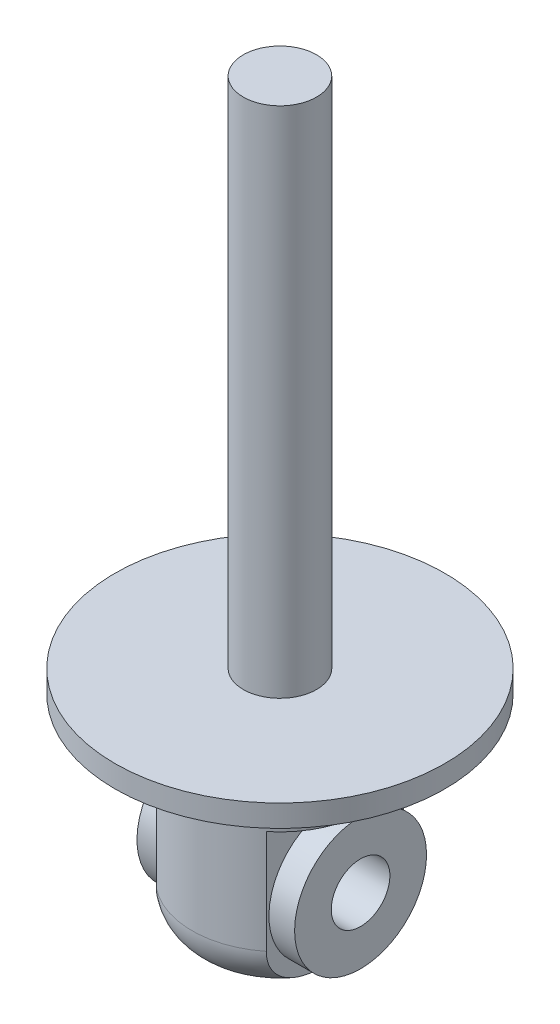
ISO-10303-21;
HEADER;
FILE_DESCRIPTION(('STEP AP214'),'2;1');
FILE_NAME('part.step','',(''),(''),'','','');
FILE_SCHEMA(('AUTOMOTIVE_DESIGN { 1 0 10303 214 1 1 1 1 }'));
ENDSEC;
DATA;
#1=APPLICATION_CONTEXT('core data for automotive mechanical design processes');
#2=APPLICATION_PROTOCOL_DEFINITION('international standard','automotive_design',2000,#1);
#3=PRODUCT_CONTEXT('',#1,'mechanical');
#4=PRODUCT('Part','Part','',(#3));
#5=PRODUCT_RELATED_PRODUCT_CATEGORY('part','',(#4));
#6=PRODUCT_DEFINITION_FORMATION('','',#4);
#7=PRODUCT_DEFINITION_CONTEXT('part definition',#1,'design');
#8=PRODUCT_DEFINITION('design','',#6,#7);
#9=PRODUCT_DEFINITION_SHAPE('','',#8);
#10=(LENGTH_UNIT() NAMED_UNIT(*) SI_UNIT(.MILLI.,.METRE.));
#11=(NAMED_UNIT(*) PLANE_ANGLE_UNIT() SI_UNIT($,.RADIAN.));
#12=(NAMED_UNIT(*) SI_UNIT($,.STERADIAN.) SOLID_ANGLE_UNIT());
#13=UNCERTAINTY_MEASURE_WITH_UNIT(LENGTH_MEASURE(1.E-05),#10,'distance_accuracy_value','');
#14=(GEOMETRIC_REPRESENTATION_CONTEXT(3) GLOBAL_UNCERTAINTY_ASSIGNED_CONTEXT((#13)) GLOBAL_UNIT_ASSIGNED_CONTEXT((#10,
#11,#12)) REPRESENTATION_CONTEXT('',''));
#15=CARTESIAN_POINT('',(0.,0.,0.));
#16=DIRECTION('',(0.,0.,1.));
#17=DIRECTION('',(1.,0.,0.));
#18=AXIS2_PLACEMENT_3D('',#15,#16,#17);
#19=CARTESIAN_POINT('',(-7.5,0.,-22.5));
#20=DIRECTION('',(-1.,0.,0.));
#21=DIRECTION('',(0.,-1.,0.));
#22=AXIS2_PLACEMENT_3D('',#19,#20,#21);
#23=PLANE('',#22);
#24=DIRECTION('',(0.,1.,0.));
#25=VECTOR('',#24,1.);
#26=CARTESIAN_POINT('',(-7.49999999999999,-28.,9.3674969975976));
#27=LINE('',#26,#25);
#28=CARTESIAN_POINT('',(-7.5,-22.,9.3674969975976));
#29=VERTEX_POINT('',#28);
#30=CARTESIAN_POINT('',(-7.5,-7.84093073722917,9.36749699759759));
#31=VERTEX_POINT('',#30);
#32=EDGE_CURVE('E178',#29,#31,#27,.T.);
#33=ORIENTED_EDGE('',*,*,#32,.T.);
#34=DIRECTION('',(0.,0.,1.));
#35=VECTOR('',#34,1.);
#36=CARTESIAN_POINT('',(-7.5,-7.84093073722917,-22.5));
#37=LINE('',#36,#35);
#38=CARTESIAN_POINT('',(-7.5,-7.84093073722917,-9.36749699759761));
#39=VERTEX_POINT('',#38);
#40=EDGE_CURVE('E96',#39,#31,#37,.T.);
#41=ORIENTED_EDGE('',*,*,#40,.F.);
#42=DIRECTION('',(0.,1.,0.));
#43=VECTOR('',#42,1.);
#44=CARTESIAN_POINT('',(-7.49999999999999,-28.,-9.3674969975976));
#45=LINE('',#44,#43);
#46=CARTESIAN_POINT('',(-7.5,-22.,-9.3674969975976));
#47=VERTEX_POINT('',#46);
#48=EDGE_CURVE('E67',#39,#47,#45,.F.);
#49=ORIENTED_EDGE('',*,*,#48,.T.);
#50=CARTESIAN_POINT('',(-7.5,-27.8094750193111,0.));
#51=CARTESIAN_POINT('',(-7.5,-27.8094752958151,-0.184521628242419));
#52=CARTESIAN_POINT('',(-7.5,-27.8077270322999,-0.369043480287191));
#53=CARTESIAN_POINT('',(-7.5,-27.8006130628877,-0.737999394292284));
#54=CARTESIAN_POINT('',(-7.5,-27.7952477367066,-0.922433463434384));
#55=CARTESIAN_POINT('',(-7.5,-27.780538513706,-1.29122559425462));
#56=CARTESIAN_POINT('',(-7.5,-27.7711929215574,-1.47558358999919));
#57=CARTESIAN_POINT('',(-7.5,-27.7479507640883,-1.84401846668315));
#58=CARTESIAN_POINT('',(-7.5,-27.734054140347,-2.02809534398339));
#59=CARTESIAN_POINT('',(-7.5,-27.701027325669,-2.39498843631837));
#60=CARTESIAN_POINT('',(-7.5,-27.6819201299087,-2.57780665418326));
#61=CARTESIAN_POINT('',(-7.5,-27.6375682217561,-2.94269408038083));
#62=CARTESIAN_POINT('',(-7.5,-27.6123230495969,-3.12476323156505));
#63=CARTESIAN_POINT('',(-7.5,-27.5259360262262,-3.6691632505479));
#64=CARTESIAN_POINT('',(-7.5,-27.4541196223952,-4.02997739530099));
#65=CARTESIAN_POINT('',(-7.5,-27.315114172541,-4.57935988961709));
#66=CARTESIAN_POINT('',(-7.5,-27.2608348848703,-4.77122256452969));
#67=CARTESIAN_POINT('',(-7.5,-27.1402411036094,-5.15109529504942));
#68=CARTESIAN_POINT('',(-7.5,-27.0739312594077,-5.33910680786539));
#69=CARTESIAN_POINT('',(-7.5,-26.928148698992,-5.70992505463463));
#70=CARTESIAN_POINT('',(-7.5,-26.8486797977089,-5.8927332791208));
#71=CARTESIAN_POINT('',(-7.5,-26.6756224712841,-6.25155879665883));
#72=CARTESIAN_POINT('',(-7.5,-26.5820364486502,-6.42757723883459));
#73=CARTESIAN_POINT('',(-7.5,-26.3958384208508,-6.74413785402998));
#74=CARTESIAN_POINT('',(-7.5,-26.3053527427416,-6.8859302136676));
#75=CARTESIAN_POINT('',(-7.5,-26.1136422044668,-7.16205254122039));
#76=CARTESIAN_POINT('',(-7.5,-26.0124194056704,-7.29638393401336));
#77=CARTESIAN_POINT('',(-7.5,-25.7991822855038,-7.55627452274061));
#78=CARTESIAN_POINT('',(-7.5,-25.6871652583255,-7.6818315054992));
#79=CARTESIAN_POINT('',(-7.5,-25.4525813942248,-7.92270374400352));
#80=CARTESIAN_POINT('',(-7.5,-25.3300144777409,-8.03801892249803));
#81=CARTESIAN_POINT('',(-7.5,-25.0736714823962,-8.25792234562975));
#82=CARTESIAN_POINT('',(-7.5,-24.9398051473305,-8.36240569865935));
#83=CARTESIAN_POINT('',(-7.5,-24.662616920615,-8.55796576900282));
#84=CARTESIAN_POINT('',(-7.5,-24.5192963548439,-8.64904436046083));
#85=CARTESIAN_POINT('',(-7.5,-24.2243409104845,-8.81636481076627));
#86=CARTESIAN_POINT('',(-7.5,-24.0727112205184,-8.89261579636784));
#87=CARTESIAN_POINT('',(-7.5,-23.7624095052739,-9.02909243430965));
#88=CARTESIAN_POINT('',(-7.5,-23.6037388369551,-9.08932115899454));
#89=CARTESIAN_POINT('',(-7.5,-23.3052245459151,-9.1849514334904));
#90=CARTESIAN_POINT('',(-7.5,-23.1661361294911,-9.22272405795733));
#91=CARTESIAN_POINT('',(-7.5,-22.8851087613884,-9.28547940350164));
#92=CARTESIAN_POINT('',(-7.5,-22.7431701638949,-9.31046370365637));
#93=CARTESIAN_POINT('',(-7.5,-22.4576599589478,-9.34730641699016));
#94=CARTESIAN_POINT('',(-7.5,-22.3140890586128,-9.35917031033292));
#95=CARTESIAN_POINT('',(-7.5,-22.0264648581988,-9.36963164548865));
#96=CARTESIAN_POINT('',(-7.5,-21.8824115750842,-9.36822954903948));
#97=CARTESIAN_POINT('',(-7.5,-21.6061914815275,-9.35280339576898));
#98=CARTESIAN_POINT('',(-7.5,-21.4739684759153,-9.33976569953801));
#99=CARTESIAN_POINT('',(-7.5,-21.2110534946456,-9.3025636387872));
#100=CARTESIAN_POINT('',(-7.5,-21.0803620180608,-9.27839574533066));
#101=CARTESIAN_POINT('',(-7.5,-20.8215410609612,-9.21922065645586));
#102=CARTESIAN_POINT('',(-7.5,-20.6934101253726,-9.18421981495561));
#103=CARTESIAN_POINT('',(-7.5,-20.4404340442512,-9.1037455253616));
#104=CARTESIAN_POINT('',(-7.5,-20.3155901493276,-9.05826815366643));
#105=CARTESIAN_POINT('',(-7.5,-20.0692031015505,-8.95699564520569));
#106=CARTESIAN_POINT('',(-7.5,-19.9476868658852,-8.90113499399755));
#107=CARTESIAN_POINT('',(-7.5,-19.7094920695403,-8.77987692751896));
#108=CARTESIAN_POINT('',(-7.5,-19.5928152563103,-8.71447610526943));
#109=CARTESIAN_POINT('',(-7.5,-19.2509911073174,-8.50489875856371));
#110=CARTESIAN_POINT('',(-7.5,-19.0339195251877,-8.34729299116934));
#111=CARTESIAN_POINT('',(-7.5,-18.609337427954,-7.98870608163153));
#112=CARTESIAN_POINT('',(-7.5,-18.4039002281567,-7.78529755950601));
#113=CARTESIAN_POINT('',(-7.5,-18.0246758733926,-7.35109040646742));
#114=CARTESIAN_POINT('',(-7.5,-17.8508837047537,-7.12029612399674));
#115=CARTESIAN_POINT('',(-7.5,-17.5744409595824,-6.69864287979115));
#116=CARTESIAN_POINT('',(-7.5,-17.4648689537028,-6.51223410047273));
#117=CARTESIAN_POINT('',(-7.5,-17.2626904112623,-6.13034538679086));
#118=CARTESIAN_POINT('',(-7.5,-17.1700919878543,-5.93486117014358));
#119=CARTESIAN_POINT('',(-7.5,-17.0006313082269,-5.53658641063457));
#120=CARTESIAN_POINT('',(-7.5,-16.9238147555949,-5.3337765932138));
#121=CARTESIAN_POINT('',(-7.5,-16.784875362625,-4.9233142846081));
#122=CARTESIAN_POINT('',(-7.5,-16.7227484430634,-4.71566315546474));
#123=CARTESIAN_POINT('',(-7.5,-16.5386673542946,-4.02250667384635));
#124=CARTESIAN_POINT('',(-7.5,-16.4449803111871,-3.52942656369881));
#125=CARTESIAN_POINT('',(-7.5,-16.3412352530644,-2.78498720051466));
#126=CARTESIAN_POINT('',(-7.5,-16.3127705467372,-2.5356855777005));
#127=CARTESIAN_POINT('',(-7.5,-16.2658269581612,-2.03612434937438));
#128=CARTESIAN_POINT('',(-7.5,-16.2473468655649,-1.78586486368142));
#129=CARTESIAN_POINT('',(-7.5,-16.2184283009414,-1.28363112408652));
#130=CARTESIAN_POINT('',(-7.5,-16.208031590786,-1.03165466176091));
#131=CARTESIAN_POINT('',(-7.5,-16.1941849220444,-0.527501194688677));
#132=CARTESIAN_POINT('',(-7.5,-16.1907352988047,-0.275324180848909));
#133=CARTESIAN_POINT('',(-7.5,-16.1903333462322,0.228731345602979));
#134=CARTESIAN_POINT('',(-7.5,-16.193373232494,0.480609853630178));
#135=CARTESIAN_POINT('',(-7.5,-16.2063332691715,0.984173581494271));
#136=CARTESIAN_POINT('',(-7.5,-16.2162528039696,1.23585881660874));
#137=CARTESIAN_POINT('',(-7.5,-16.2454935008677,1.76278825668934));
#138=CARTESIAN_POINT('',(-7.5,-16.2656211327378,2.03798990109171));
#139=CARTESIAN_POINT('',(-7.5,-16.3180418431018,2.58731345976839));
#140=CARTESIAN_POINT('',(-7.5,-16.3503365349836,2.86143522597444));
#141=CARTESIAN_POINT('',(-7.5,-16.4300545548583,3.40623279358437));
#142=CARTESIAN_POINT('',(-7.5,-16.4774071358833,3.67691867401873));
#143=CARTESIAN_POINT('',(-7.5,-16.5907053400646,4.21439476079951));
#144=CARTESIAN_POINT('',(-7.5,-16.6566449229111,4.4811862031647));
#145=CARTESIAN_POINT('',(-7.5,-16.7911834026755,4.94217748017443));
#146=CARTESIAN_POINT('',(-7.5,-16.8549558474619,5.13778160857807));
#147=CARTESIAN_POINT('',(-7.5,-16.9961265709521,5.5239942274174));
#148=CARTESIAN_POINT('',(-7.5,-17.0735207892669,5.71460418712136));
#149=CARTESIAN_POINT('',(-7.5,-17.2430793617625,6.08921987221889));
#150=CARTESIAN_POINT('',(-7.5,-17.3352463319138,6.27322442084438));
#151=CARTESIAN_POINT('',(-7.5,-17.5351759469553,6.63256976145457));
#152=CARTESIAN_POINT('',(-7.5,-17.6429345063483,6.80791280693598));
#153=CARTESIAN_POINT('',(-7.5,-17.8487615005736,7.10989658300674));
#154=CARTESIAN_POINT('',(-7.5,-17.9436617626469,7.23870103997639));
#155=CARTESIAN_POINT('',(-7.5,-18.143229826346,7.48856622066219));
#156=CARTESIAN_POINT('',(-7.5,-18.2478987883735,7.60962602152205));
#157=CARTESIAN_POINT('',(-7.5,-18.4668045949393,7.84271387792474));
#158=CARTESIAN_POINT('',(-7.5,-18.5810384459287,7.95474473789612));
#159=CARTESIAN_POINT('',(-7.5,-18.8187268203134,8.16854933672494));
#160=CARTESIAN_POINT('',(-7.5,-18.9421800591116,8.27032449994957));
#161=CARTESIAN_POINT('',(-7.5,-19.1987356397018,8.46313596223061));
#162=CARTESIAN_POINT('',(-7.5,-19.3319055781875,8.55408255407203));
#163=CARTESIAN_POINT('',(-7.5,-19.6061418402457,8.72304401015934));
#164=CARTESIAN_POINT('',(-7.5,-19.747204378254,8.80106500403696));
#165=CARTESIAN_POINT('',(-7.5,-20.0362068877473,8.94309470867639));
#166=CARTESIAN_POINT('',(-7.5,-20.1841460034049,9.00710515749598));
#167=CARTESIAN_POINT('',(-7.5,-20.4856380297523,9.12014361193693));
#168=CARTESIAN_POINT('',(-7.5,-20.6391901444676,9.16917373274798));
#169=CARTESIAN_POINT('',(-7.5,-20.9313639562727,9.24643392787081));
#170=CARTESIAN_POINT('',(-7.5,-21.0695088202567,9.2764768563288));
#171=CARTESIAN_POINT('',(-7.5,-21.3479315795213,9.32406143536891));
#172=CARTESIAN_POINT('',(-7.5,-21.4882092809526,9.34160421520928));
#173=CARTESIAN_POINT('',(-7.5,-21.769719609589,9.36396002322678));
#174=CARTESIAN_POINT('',(-7.5,-21.9109518422674,9.36877802253041));
#175=CARTESIAN_POINT('',(-7.5,-22.1932734390957,9.36563613906261));
#176=CARTESIAN_POINT('',(-7.5,-22.3343628067459,9.35767657732182));
#177=CARTESIAN_POINT('',(-7.5,-22.6064011749062,9.32998563551063));
#178=CARTESIAN_POINT('',(-7.5,-22.7374295539783,9.31102660205279));
#179=CARTESIAN_POINT('',(-7.5,-22.9974780227225,9.26218788836622));
#180=CARTESIAN_POINT('',(-7.5,-23.1264974548056,9.23230470755188));
#181=CARTESIAN_POINT('',(-7.5,-23.3815508516768,9.16196479385525));
#182=CARTESIAN_POINT('',(-7.5,-23.5075862018083,9.12151307666088));
#183=CARTESIAN_POINT('',(-7.5,-23.7559772755244,9.03044888037393));
#184=CARTESIAN_POINT('',(-7.5,-23.8783315975104,8.97983258590814));
#185=CARTESIAN_POINT('',(-7.5,-24.1205569584555,8.8680617574251));
#186=CARTESIAN_POINT('',(-7.5,-24.2403549182387,8.80674877020291));
#187=CARTESIAN_POINT('',(-7.5,-24.4747211723639,8.67480187441993));
#188=CARTESIAN_POINT('',(-7.5,-24.5892875713423,8.60416462323317));
#189=CARTESIAN_POINT('',(-7.5,-24.9242270275788,8.37928997825773));
#190=CARTESIAN_POINT('',(-7.5,-25.13600210755,8.21201407264852));
#191=CARTESIAN_POINT('',(-7.5,-25.5504485361803,7.832942739178));
#192=CARTESIAN_POINT('',(-7.5,-25.7507010772538,7.618532285847));
#193=CARTESIAN_POINT('',(-7.5,-26.1185076671662,7.16337882817299));
#194=CARTESIAN_POINT('',(-7.5,-26.2860513710234,6.9226275303298));
#195=CARTESIAN_POINT('',(-7.5,-26.5545024709803,6.4788664395953));
#196=CARTESIAN_POINT('',(-7.5,-26.6619013252763,6.279707295078));
#197=CARTESIAN_POINT('',(-7.5,-26.858559219587,5.87254463104013));
#198=CARTESIAN_POINT('',(-7.5,-26.9478095430477,5.66453691936402));
#199=CARTESIAN_POINT('',(-7.5,-27.1096214973705,5.24180758530233));
#200=CARTESIAN_POINT('',(-7.5,-27.1821555960046,5.02707553901332));
#201=CARTESIAN_POINT('',(-7.5,-27.3121001369762,4.59305326757356));
#202=CARTESIAN_POINT('',(-7.5,-27.3695048137837,4.37376133898657));
#203=CARTESIAN_POINT('',(-7.5,-27.4981886749365,3.81417726059937));
#204=CARTESIAN_POINT('',(-7.5,-27.5604951716191,3.47183296905169));
#205=CARTESIAN_POINT('',(-7.5,-27.6609019684328,2.78359200614869));
#206=CARTESIAN_POINT('',(-7.5,-27.6989863972919,2.43769315620305));
#207=CARTESIAN_POINT('',(-7.5,-27.7425563308733,1.91723181279188));
#208=CARTESIAN_POINT('',(-7.5,-27.7548291128016,1.74318957751326));
#209=CARTESIAN_POINT('',(-7.5,-27.7753986995787,1.39487161182967));
#210=CARTESIAN_POINT('',(-7.5,-27.7836956019396,1.22059588725638));
#211=CARTESIAN_POINT('',(-7.5,-27.796777523185,0.87196539298604));
#212=CARTESIAN_POINT('',(-7.5,-27.8015635129394,0.697610658492171));
#213=CARTESIAN_POINT('',(-7.5,-27.8079121855994,0.348837350643893));
#214=CARTESIAN_POINT('',(-7.5,-27.8094747579462,0.174418775305038));
#215=CARTESIAN_POINT('',(-7.5,-27.8094750193111,0.));
#216=B_SPLINE_CURVE_WITH_KNOTS('',3,(#50,#51,#52,#53,#54,#55,#56,#57,#58,#59,#60,#61,#62,#63,
#64,#65,#66,#67,#68,#69,#70,#71,#72,#73,#74,#75,#76,#77,#78,#79,#80,#81,#82,#83,#84,#85,#86,#87,
#88,#89,#90,#91,#92,#93,#94,#95,#96,#97,#98,#99,#100,#101,#102,#103,#104,#105,#106,#107,#108,
#109,#110,#111,#112,#113,#114,#115,#116,#117,#118,#119,#120,#121,#122,#123,#124,#125,#126,#127,
#128,#129,#130,#131,#132,#133,#134,#135,#136,#137,#138,#139,#140,#141,#142,#143,#144,#145,#146,
#147,#148,#149,#150,#151,#152,#153,#154,#155,#156,#157,#158,#159,#160,#161,#162,#163,#164,#165,
#166,#167,#168,#169,#170,#171,#172,#173,#174,#175,#176,#177,#178,#179,#180,#181,#182,#183,#184,
#185,#186,#187,#188,#189,#190,#191,#192,#193,#194,#195,#196,#197,#198,#199,#200,#201,#202,#203,
#204,#205,#206,#207,#208,#209,#210,#211,#212,#213,#214,#215),.UNSPECIFIED.,.T.,.F.,(4,2,2,2,2,2,
2,2,2,2,2,2,2,2,2,2,2,2,2,2,2,2,2,2,2,2,2,2,2,2,2,2,2,2,2,2,2,2,2,2,2,2,2,2,2,2,2,2,2,2,2,2,2,2,
2,2,2,2,2,2,2,2,2,2,2,2,2,2,2,2,2,2,2,2,2,2,2,2,2,2,2,2,4),(0.,0.553556541747908,
1.10705498067111,1.6607894093517,2.21453094651203,2.76586720349669,3.31724477121585,
4.41912680182766,5.01698525599297,5.61461314908642,6.21206808675634,6.80942146164093,
7.31357153503217,7.81762499361292,8.32180513447662,8.82598907791494,9.33467160980088,
9.84328295415676,10.3515802378956,10.8597799828438,11.291588037567,11.7233427606026,
12.1549170790764,12.5864763761707,12.9845986570771,13.3828472534997,13.7808627038906,
14.1790274594522,14.579795450788,14.9807069160888,15.7821103743006,16.6461503316802,
17.5100532757815,18.1578732554314,18.8060020817716,19.4559821948789,20.1057815998326,
21.6069748462106,22.3596793389022,23.1122925673176,23.8687687149109,24.6252813779039,
25.3808870860739,26.1364251884592,26.9640249034878,27.7917343993232,28.6156111127982,
29.4392203950451,30.0559954213971,30.6725869093732,31.2892877047367,31.9058271963483,
32.3853559200308,32.8649416785199,33.3443778968313,33.823747436381,34.3068464150843,
34.7897156366603,35.2725249226045,35.7552660053908,36.1788379642465,36.6023716529343,
37.0257398573389,37.4490974249689,37.8458122806135,38.2426543730445,38.639308470493,
39.0361117351622,39.4393886143668,39.8428104576492,40.6491243408277,41.5260051520067,
42.403162850804,43.0810551134699,43.7592721958252,44.4385984678267,45.1181832448308,
46.1608437011148,47.2041866484774,47.7275747628343,48.2509500399341,48.7741805338585,
49.2974289735857),.UNSPECIFIED.);
#217=EDGE_CURVE('E108',#29,#47,#216,.T.);
#218=ORIENTED_EDGE('',*,*,#217,.F.);
#219=EDGE_LOOP('',(#33,#41,#49,#218));
#220=FACE_BOUND('',#219,.T.);
#221=CARTESIAN_POINT('',(-7.5,-18.,0.));
#222=DIRECTION('',(-1.,0.,0.));
#223=DIRECTION('',(0.,-1.,0.));
#224=AXIS2_PLACEMENT_3D('',#221,#222,#223);
#225=CIRCLE('',#224,9.);
#226=CARTESIAN_POINT('',(-7.5,-27.,0.));
#227=VERTEX_POINT('',#226);
#228=EDGE_CURVE('E223',#227,#227,#225,.T.);
#229=ORIENTED_EDGE('',*,*,#228,.F.);
#230=EDGE_LOOP('',(#229));
#231=FACE_BOUND('',#230,.T.);
#232=ADVANCED_FACE('F42',(#220,#231),#23,.T.);
#233=CARTESIAN_POINT('',(7.5,0.,-22.5));
#234=DIRECTION('',(-1.,0.,0.));
#235=DIRECTION('',(0.,-1.,0.));
#236=AXIS2_PLACEMENT_3D('',#233,#234,#235);
#237=PLANE('',#236);
#238=CARTESIAN_POINT('',(7.5,-27.8094750193111,0.));
#239=CARTESIAN_POINT('',(7.5,-27.8094752958151,-0.18452162824242));
#240=CARTESIAN_POINT('',(7.5,-27.8077270322999,-0.369043480287192));
#241=CARTESIAN_POINT('',(7.5,-27.8006130628877,-0.737999394292286));
#242=CARTESIAN_POINT('',(7.5,-27.7952477367066,-0.922433463434386));
#243=CARTESIAN_POINT('',(7.5,-27.780538513706,-1.29122559425462));
#244=CARTESIAN_POINT('',(7.5,-27.7711929215574,-1.47558358999919));
#245=CARTESIAN_POINT('',(7.5,-27.7479507640883,-1.84401846668315));
#246=CARTESIAN_POINT('',(7.5,-27.734054140347,-2.0280953439834));
#247=CARTESIAN_POINT('',(7.5,-27.701027325669,-2.39498843631837));
#248=CARTESIAN_POINT('',(7.5,-27.6819201299087,-2.57780665418327));
#249=CARTESIAN_POINT('',(7.5,-27.6375682217561,-2.94269408038084));
#250=CARTESIAN_POINT('',(7.5,-27.6123230495969,-3.12476323156505));
#251=CARTESIAN_POINT('',(7.5,-27.5259360262262,-3.6691632505479));
#252=CARTESIAN_POINT('',(7.5,-27.4541196223952,-4.029977395301));
#253=CARTESIAN_POINT('',(7.5,-27.315114172541,-4.57935988961709));
#254=CARTESIAN_POINT('',(7.5,-27.2608348848703,-4.7712225645297));
#255=CARTESIAN_POINT('',(7.5,-27.1402411036094,-5.15109529504943));
#256=CARTESIAN_POINT('',(7.5,-27.0739312594077,-5.3391068078654));
#257=CARTESIAN_POINT('',(7.5,-26.9281486989919,-5.70992505463464));
#258=CARTESIAN_POINT('',(7.5,-26.8486797977089,-5.8927332791208));
#259=CARTESIAN_POINT('',(7.5,-26.6756224712841,-6.25155879665883));
#260=CARTESIAN_POINT('',(7.5,-26.5820364486501,-6.4275772388346));
#261=CARTESIAN_POINT('',(7.5,-26.3958384208508,-6.74413785402998));
#262=CARTESIAN_POINT('',(7.5,-26.3053527427416,-6.8859302136676));
#263=CARTESIAN_POINT('',(7.5,-26.1136422044668,-7.16205254122039));
#264=CARTESIAN_POINT('',(7.5,-26.0124194056704,-7.29638393401337));
#265=CARTESIAN_POINT('',(7.5,-25.7991822855038,-7.55627452274062));
#266=CARTESIAN_POINT('',(7.5,-25.6871652583255,-7.6818315054992));
#267=CARTESIAN_POINT('',(7.5,-25.4525813942248,-7.92270374400352));
#268=CARTESIAN_POINT('',(7.5,-25.3300144777409,-8.03801892249803));
#269=CARTESIAN_POINT('',(7.5,-25.0736714823962,-8.25792234562976));
#270=CARTESIAN_POINT('',(7.5,-24.9398051473305,-8.36240569865935));
#271=CARTESIAN_POINT('',(7.5,-24.662616920615,-8.55796576900282));
#272=CARTESIAN_POINT('',(7.5,-24.5192963548439,-8.64904436046083));
#273=CARTESIAN_POINT('',(7.5,-24.2243409104845,-8.81636481076627));
#274=CARTESIAN_POINT('',(7.5,-24.0727112205184,-8.89261579636784));
#275=CARTESIAN_POINT('',(7.5,-23.7624095052739,-9.02909243430965));
#276=CARTESIAN_POINT('',(7.5,-23.6037388369551,-9.08932115899453));
#277=CARTESIAN_POINT('',(7.5,-23.3052245459151,-9.1849514334904));
#278=CARTESIAN_POINT('',(7.5,-23.166136129491,-9.22272405795734));
#279=CARTESIAN_POINT('',(7.5,-22.8851087613883,-9.28547940350164));
#280=CARTESIAN_POINT('',(7.5,-22.7431701638949,-9.31046370365637));
#281=CARTESIAN_POINT('',(7.5,-22.4576599589478,-9.34730641699015));
#282=CARTESIAN_POINT('',(7.5,-22.3140890586128,-9.35917031033292));
#283=CARTESIAN_POINT('',(7.5,-22.0264648581988,-9.36963164548865));
#284=CARTESIAN_POINT('',(7.5,-21.8824115750842,-9.36822954903947));
#285=CARTESIAN_POINT('',(7.5,-21.6061914815275,-9.35280339576898));
#286=CARTESIAN_POINT('',(7.5,-21.4739684759153,-9.33976569953801));
#287=CARTESIAN_POINT('',(7.5,-21.2110534946456,-9.3025636387872));
#288=CARTESIAN_POINT('',(7.5,-21.0803620180608,-9.27839574533065));
#289=CARTESIAN_POINT('',(7.5,-20.8215410609612,-9.21922065645586));
#290=CARTESIAN_POINT('',(7.5,-20.6934101253726,-9.1842198149556));
#291=CARTESIAN_POINT('',(7.5,-20.4404340442512,-9.1037455253616));
#292=CARTESIAN_POINT('',(7.5,-20.3155901493276,-9.05826815366643));
#293=CARTESIAN_POINT('',(7.5,-20.0692031015505,-8.95699564520569));
#294=CARTESIAN_POINT('',(7.5,-19.9476868658852,-8.90113499399755));
#295=CARTESIAN_POINT('',(7.5,-19.7094920695403,-8.77987692751896));
#296=CARTESIAN_POINT('',(7.5,-19.5928152563103,-8.71447610526942));
#297=CARTESIAN_POINT('',(7.5,-19.2509911073174,-8.50489875856371));
#298=CARTESIAN_POINT('',(7.5,-19.0339195251877,-8.34729299116934));
#299=CARTESIAN_POINT('',(7.5,-18.609337427954,-7.98870608163152));
#300=CARTESIAN_POINT('',(7.5,-18.4039002281567,-7.785297559506));
#301=CARTESIAN_POINT('',(7.5,-18.0246758733926,-7.35109040646741));
#302=CARTESIAN_POINT('',(7.5,-17.8508837047537,-7.12029612399673));
#303=CARTESIAN_POINT('',(7.5,-17.5744409595824,-6.69864287979114));
#304=CARTESIAN_POINT('',(7.5,-17.4648689537028,-6.51223410047272));
#305=CARTESIAN_POINT('',(7.5,-17.2626904112622,-6.13034538679085));
#306=CARTESIAN_POINT('',(7.5,-17.1700919878543,-5.93486117014357));
#307=CARTESIAN_POINT('',(7.5,-17.0006313082269,-5.53658641063456));
#308=CARTESIAN_POINT('',(7.5,-16.9238147555949,-5.33377659321379));
#309=CARTESIAN_POINT('',(7.5,-16.784875362625,-4.92331428460808));
#310=CARTESIAN_POINT('',(7.5,-16.7227484430634,-4.71566315546473));
#311=CARTESIAN_POINT('',(7.5,-16.5386673542946,-4.02250667384633));
#312=CARTESIAN_POINT('',(7.5,-16.4449803111871,-3.52942656369879));
#313=CARTESIAN_POINT('',(7.5,-16.3412352530644,-2.78498720051464));
#314=CARTESIAN_POINT('',(7.5,-16.3127705467372,-2.53568557770047));
#315=CARTESIAN_POINT('',(7.5,-16.2658269581612,-2.03612434937436));
#316=CARTESIAN_POINT('',(7.5,-16.2473468655649,-1.78586486368139));
#317=CARTESIAN_POINT('',(7.5,-16.2184283009414,-1.2836311240865));
#318=CARTESIAN_POINT('',(7.5,-16.208031590786,-1.03165466176088));
#319=CARTESIAN_POINT('',(7.5,-16.1941849220444,-0.527501194688648));
#320=CARTESIAN_POINT('',(7.5,-16.1907352988047,-0.275324180848878));
#321=CARTESIAN_POINT('',(7.5,-16.1903333462322,0.228731345603011));
#322=CARTESIAN_POINT('',(7.5,-16.193373232494,0.480609853630211));
#323=CARTESIAN_POINT('',(7.5,-16.2063332691715,0.984173581494305));
#324=CARTESIAN_POINT('',(7.5,-16.2162528039696,1.23585881660878));
#325=CARTESIAN_POINT('',(7.5,-16.2454935008677,1.76278825668937));
#326=CARTESIAN_POINT('',(7.5,-16.2656211327378,2.03798990109175));
#327=CARTESIAN_POINT('',(7.5,-16.3180418431018,2.58731345976842));
#328=CARTESIAN_POINT('',(7.5,-16.3503365349836,2.86143522597446));
#329=CARTESIAN_POINT('',(7.5,-16.4300545548583,3.40623279358439));
#330=CARTESIAN_POINT('',(7.5,-16.4774071358833,3.67691867401875));
#331=CARTESIAN_POINT('',(7.5,-16.5907053400646,4.21439476079953));
#332=CARTESIAN_POINT('',(7.5,-16.6566449229111,4.48118620316471));
#333=CARTESIAN_POINT('',(7.5,-16.7911834026755,4.94217748017443));
#334=CARTESIAN_POINT('',(7.5,-16.8549558474619,5.13778160857808));
#335=CARTESIAN_POINT('',(7.5,-16.9961265709521,5.5239942274174));
#336=CARTESIAN_POINT('',(7.5,-17.073520789267,5.71460418712137));
#337=CARTESIAN_POINT('',(7.5,-17.2430793617625,6.0892198722189));
#338=CARTESIAN_POINT('',(7.5,-17.3352463319138,6.27322442084439));
#339=CARTESIAN_POINT('',(7.5,-17.5351759469553,6.63256976145458));
#340=CARTESIAN_POINT('',(7.5,-17.6429345063483,6.80791280693598));
#341=CARTESIAN_POINT('',(7.5,-17.8487615005737,7.10989658300675));
#342=CARTESIAN_POINT('',(7.5,-17.9436617626469,7.2387010399764));
#343=CARTESIAN_POINT('',(7.5,-18.143229826346,7.48856622066219));
#344=CARTESIAN_POINT('',(7.5,-18.2478987883735,7.60962602152205));
#345=CARTESIAN_POINT('',(7.5,-18.4668045949393,7.84271387792474));
#346=CARTESIAN_POINT('',(7.5,-18.5810384459287,7.95474473789612));
#347=CARTESIAN_POINT('',(7.5,-18.8187268203134,8.16854933672495));
#348=CARTESIAN_POINT('',(7.5,-18.9421800591116,8.27032449994957));
#349=CARTESIAN_POINT('',(7.5,-19.1987356397018,8.46313596223061));
#350=CARTESIAN_POINT('',(7.5,-19.3319055781875,8.55408255407203));
#351=CARTESIAN_POINT('',(7.5,-19.6061418402457,8.72304401015934));
#352=CARTESIAN_POINT('',(7.5,-19.747204378254,8.80106500403696));
#353=CARTESIAN_POINT('',(7.5,-20.0362068877473,8.94309470867639));
#354=CARTESIAN_POINT('',(7.5,-20.1841460034049,9.00710515749598));
#355=CARTESIAN_POINT('',(7.5,-20.4856380297523,9.12014361193693));
#356=CARTESIAN_POINT('',(7.5,-20.6391901444676,9.16917373274798));
#357=CARTESIAN_POINT('',(7.5,-20.9313639562727,9.24643392787081));
#358=CARTESIAN_POINT('',(7.5,-21.0695088202567,9.27647685632879));
#359=CARTESIAN_POINT('',(7.5,-21.3479315795213,9.32406143536891));
#360=CARTESIAN_POINT('',(7.5,-21.4882092809526,9.34160421520928));
#361=CARTESIAN_POINT('',(7.5,-21.769719609589,9.36396002322678));
#362=CARTESIAN_POINT('',(7.5,-21.9109518422674,9.36877802253041));
#363=CARTESIAN_POINT('',(7.5,-22.1932734390957,9.36563613906261));
#364=CARTESIAN_POINT('',(7.5,-22.3343628067459,9.35767657732182));
#365=CARTESIAN_POINT('',(7.5,-22.6064011749062,9.32998563551062));
#366=CARTESIAN_POINT('',(7.5,-22.7374295539783,9.31102660205278));
#367=CARTESIAN_POINT('',(7.5,-22.9974780227225,9.26218788836622));
#368=CARTESIAN_POINT('',(7.5,-23.1264974548056,9.23230470755187));
#369=CARTESIAN_POINT('',(7.5,-23.3815508516768,9.16196479385525));
#370=CARTESIAN_POINT('',(7.5,-23.5075862018083,9.12151307666088));
#371=CARTESIAN_POINT('',(7.5,-23.7559772755244,9.03044888037393));
#372=CARTESIAN_POINT('',(7.5,-23.8783315975104,8.97983258590813));
#373=CARTESIAN_POINT('',(7.5,-24.1205569584555,8.86806175742509));
#374=CARTESIAN_POINT('',(7.5,-24.2403549182387,8.8067487702029));
#375=CARTESIAN_POINT('',(7.5,-24.4747211723639,8.67480187441993));
#376=CARTESIAN_POINT('',(7.5,-24.5892875713423,8.60416462323316));
#377=CARTESIAN_POINT('',(7.5,-24.9242270275788,8.37928997825773));
#378=CARTESIAN_POINT('',(7.5,-25.13600210755,8.21201407264851));
#379=CARTESIAN_POINT('',(7.5,-25.5504485361803,7.832942739178));
#380=CARTESIAN_POINT('',(7.5,-25.7507010772538,7.61853228584699));
#381=CARTESIAN_POINT('',(7.5,-26.1185076671662,7.16337882817297));
#382=CARTESIAN_POINT('',(7.5,-26.2860513710234,6.92262753032979));
#383=CARTESIAN_POINT('',(7.5,-26.5545024709803,6.47886643959529));
#384=CARTESIAN_POINT('',(7.5,-26.6619013252763,6.27970729507799));
#385=CARTESIAN_POINT('',(7.5,-26.858559219587,5.87254463104012));
#386=CARTESIAN_POINT('',(7.5,-26.9478095430477,5.664536919364));
#387=CARTESIAN_POINT('',(7.5,-27.1096214973705,5.24180758530232));
#388=CARTESIAN_POINT('',(7.5,-27.1821555960046,5.0270755390133));
#389=CARTESIAN_POINT('',(7.5,-27.3121001369762,4.59305326757355));
#390=CARTESIAN_POINT('',(7.5,-27.3695048137837,4.37376133898655));
#391=CARTESIAN_POINT('',(7.5,-27.4981886749365,3.81417726059935));
#392=CARTESIAN_POINT('',(7.5,-27.5604951716191,3.47183296905168));
#393=CARTESIAN_POINT('',(7.5,-27.6609019684328,2.78359200614868));
#394=CARTESIAN_POINT('',(7.5,-27.6989863972919,2.43769315620304));
#395=CARTESIAN_POINT('',(7.5,-27.7425563308733,1.91723181279186));
#396=CARTESIAN_POINT('',(7.5,-27.7548291128016,1.74318957751325));
#397=CARTESIAN_POINT('',(7.5,-27.7753986995787,1.39487161182966));
#398=CARTESIAN_POINT('',(7.5,-27.7836956019396,1.22059588725637));
#399=CARTESIAN_POINT('',(7.5,-27.796777523185,0.871965392986035));
#400=CARTESIAN_POINT('',(7.5,-27.8015635129394,0.697610658492168));
#401=CARTESIAN_POINT('',(7.5,-27.8079121855994,0.348837350643893));
#402=CARTESIAN_POINT('',(7.5,-27.8094747579462,0.174418775305038));
#403=CARTESIAN_POINT('',(7.5,-27.8094750193111,0.));
#404=B_SPLINE_CURVE_WITH_KNOTS('',3,(#238,#239,#240,#241,#242,#243,#244,#245,#246,#247,#248,
#249,#250,#251,#252,#253,#254,#255,#256,#257,#258,#259,#260,#261,#262,#263,#264,#265,#266,#267,
#268,#269,#270,#271,#272,#273,#274,#275,#276,#277,#278,#279,#280,#281,#282,#283,#284,#285,#286,
#287,#288,#289,#290,#291,#292,#293,#294,#295,#296,#297,#298,#299,#300,#301,#302,#303,#304,#305,
#306,#307,#308,#309,#310,#311,#312,#313,#314,#315,#316,#317,#318,#319,#320,#321,#322,#323,#324,
#325,#326,#327,#328,#329,#330,#331,#332,#333,#334,#335,#336,#337,#338,#339,#340,#341,#342,#343,
#344,#345,#346,#347,#348,#349,#350,#351,#352,#353,#354,#355,#356,#357,#358,#359,#360,#361,#362,
#363,#364,#365,#366,#367,#368,#369,#370,#371,#372,#373,#374,#375,#376,#377,#378,#379,#380,#381,
#382,#383,#384,#385,#386,#387,#388,#389,#390,#391,#392,#393,#394,#395,#396,#397,#398,#399,#400,
#401,#402,#403),.UNSPECIFIED.,.T.,.F.,(4,2,2,2,2,2,2,2,2,2,2,2,2,2,2,2,2,2,2,2,2,2,2,2,2,2,2,2,
2,2,2,2,2,2,2,2,2,2,2,2,2,2,2,2,2,2,2,2,2,2,2,2,2,2,2,2,2,2,2,2,2,2,2,2,2,2,2,2,2,2,2,2,2,2,2,2,
2,2,2,2,2,2,4),(0.,0.553556541747909,1.10705498067111,1.66078940935171,2.21453094651203,
2.7658672034967,3.31724477121586,4.41912680182768,5.01698525599298,5.61461314908643,
6.21206808675635,6.80942146164093,7.31357153503218,7.81762499361293,8.32180513447662,
8.82598907791494,9.33467160980089,9.84328295415677,10.3515802378956,10.8597799828438,
11.291588037567,11.7233427606026,12.1549170790764,12.5864763761707,12.9845986570771,
13.3828472534997,13.7808627038906,14.1790274594522,14.5797954507881,14.9807069160888,
15.7821103743006,16.6461503316802,17.5100532757815,18.1578732554314,18.8060020817716,
19.4559821948789,20.1057815998326,21.6069748462106,22.3596793389022,23.1122925673176,
23.8687687149109,24.625281377904,25.3808870860739,26.1364251884592,26.9640249034878,
27.7917343993232,28.6156111127982,29.4392203950451,30.0559954213971,30.6725869093732,
31.2892877047367,31.9058271963482,32.3853559200308,32.8649416785199,33.3443778968313,
33.823747436381,34.3068464150843,34.7897156366603,35.2725249226045,35.7552660053908,
36.1788379642465,36.6023716529342,37.0257398573389,37.4490974249689,37.8458122806135,
38.2426543730445,38.6393084704929,39.0361117351622,39.4393886143668,39.8428104576491,
40.6491243408277,41.5260051520067,42.4031628508039,43.0810551134699,43.7592721958252,
44.4385984678267,45.1181832448308,46.1608437011148,47.2041866484774,47.7275747628343,
48.2509500399341,48.7741805338585,49.2974289735857),.UNSPECIFIED.);
#405=CARTESIAN_POINT('',(7.5,-22.,9.3674969975976));
#406=VERTEX_POINT('',#405);
#407=CARTESIAN_POINT('',(7.5,-21.9999999999999,-9.36749699759765));
#408=VERTEX_POINT('',#407);
#409=EDGE_CURVE('E90',#406,#408,#404,.T.);
#410=ORIENTED_EDGE('',*,*,#409,.T.);
#411=DIRECTION('',(0.,1.,0.));
#412=VECTOR('',#411,1.);
#413=CARTESIAN_POINT('',(7.5,-28.,-9.3674969975976));
#414=LINE('',#413,#412);
#415=CARTESIAN_POINT('',(7.5,-7.84093073722917,-9.3674969975976));
#416=VERTEX_POINT('',#415);
#417=EDGE_CURVE('E85',#416,#408,#414,.F.);
#418=ORIENTED_EDGE('',*,*,#417,.F.);
#419=DIRECTION('',(0.,0.,1.));
#420=VECTOR('',#419,1.);
#421=CARTESIAN_POINT('',(7.5,-7.84093073722917,-22.5));
#422=LINE('',#421,#420);
#423=CARTESIAN_POINT('',(7.5,-7.84093073722917,9.36749699759758));
#424=VERTEX_POINT('',#423);
#425=EDGE_CURVE('E89',#416,#424,#422,.T.);
#426=ORIENTED_EDGE('',*,*,#425,.T.);
#427=DIRECTION('',(0.,1.,0.));
#428=VECTOR('',#427,1.);
#429=CARTESIAN_POINT('',(7.5,-28.,9.3674969975976));
#430=LINE('',#429,#428);
#431=EDGE_CURVE('E59',#406,#424,#430,.T.);
#432=ORIENTED_EDGE('',*,*,#431,.F.);
#433=EDGE_LOOP('',(#410,#418,#426,#432));
#434=FACE_BOUND('',#433,.T.);
#435=CARTESIAN_POINT('',(7.5,-18.,0.));
#436=DIRECTION('',(-1.,0.,0.));
#437=DIRECTION('',(0.,-1.,0.));
#438=AXIS2_PLACEMENT_3D('',#435,#436,#437);
#439=CIRCLE('',#438,9.);
#440=CARTESIAN_POINT('',(7.5,-27.,0.));
#441=VERTEX_POINT('',#440);
#442=EDGE_CURVE('E12',#441,#441,#439,.F.);
#443=ORIENTED_EDGE('',*,*,#442,.F.);
#444=EDGE_LOOP('',(#443));
#445=FACE_BOUND('',#444,.T.);
#446=ADVANCED_FACE('F87',(#434,#445),#237,.F.);
#447=CARTESIAN_POINT('',(0.,-28.,0.));
#448=DIRECTION('',(0.,1.,0.));
#449=DIRECTION('',(0.,0.,1.));
#450=AXIS2_PLACEMENT_3D('',#447,#448,#449);
#451=CYLINDRICAL_SURFACE('',#450,12.);
#452=CARTESIAN_POINT('',(0.,0.,0.));
#453=DIRECTION('',(0.,-1.,0.));
#454=DIRECTION('',(0.,0.,-1.));
#455=AXIS2_PLACEMENT_3D('',#452,#453,#454);
#456=CIRCLE('',#455,12.);
#457=CARTESIAN_POINT('',(0.,0.,-12.));
#458=VERTEX_POINT('',#457);
#459=EDGE_CURVE('E186',#458,#458,#456,.T.);
#460=ORIENTED_EDGE('',*,*,#459,.T.);
#461=EDGE_LOOP('',(#460));
#462=FACE_BOUND('',#461,.T.);
#463=ORIENTED_EDGE('',*,*,#32,.F.);
#464=CARTESIAN_POINT('',(0.,-22.,0.));
#465=DIRECTION('',(0.,-1.,0.));
#466=DIRECTION('',(0.,0.,-1.));
#467=AXIS2_PLACEMENT_3D('',#464,#465,#466);
#468=CIRCLE('',#467,12.);
#469=EDGE_CURVE('E188',#29,#406,#468,.F.);
#470=ORIENTED_EDGE('',*,*,#469,.T.);
#471=ORIENTED_EDGE('',*,*,#431,.T.);
#472=CARTESIAN_POINT('',(0.,-7.84093073722917,0.));
#473=DIRECTION('',(0.,1.,0.));
#474=DIRECTION('',(-1.,0.,0.));
#475=AXIS2_PLACEMENT_3D('',#472,#473,#474);
#476=CIRCLE('',#475,12.);
#477=EDGE_CURVE('E100',#424,#416,#476,.T.);
#478=ORIENTED_EDGE('',*,*,#477,.T.);
#479=ORIENTED_EDGE('',*,*,#417,.T.);
#480=EDGE_CURVE('E185',#408,#47,#468,.F.);
#481=ORIENTED_EDGE('',*,*,#480,.T.);
#482=ORIENTED_EDGE('',*,*,#48,.F.);
#483=CARTESIAN_POINT('',(0.,-7.84093073722917,0.));
#484=DIRECTION('',(0.,-1.,0.));
#485=DIRECTION('',(1.,0.,0.));
#486=AXIS2_PLACEMENT_3D('',#483,#484,#485);
#487=CIRCLE('',#486,12.);
#488=EDGE_CURVE('E52',#31,#39,#487,.T.);
#489=ORIENTED_EDGE('',*,*,#488,.F.);
#490=EDGE_LOOP('',(#463,#470,#471,#478,#479,#481,#482,#489));
#491=FACE_BOUND('',#490,.T.);
#492=ADVANCED_FACE('F105',(#462,#491),#451,.T.);
#493=CARTESIAN_POINT('',(0.,-22.,0.));
#494=DIRECTION('',(0.,-1.,0.));
#495=DIRECTION('',(0.,0.,-1.));
#496=AXIS2_PLACEMENT_3D('',#493,#494,#495);
#497=TOROIDAL_SURFACE('',#496,6.,6.);
#498=CARTESIAN_POINT('',(0.,-28.,0.));
#499=DIRECTION('',(0.,-1.,0.));
#500=DIRECTION('',(0.,0.,-1.));
#501=AXIS2_PLACEMENT_3D('',#498,#499,#500);
#502=CIRCLE('',#501,6.);
#503=CARTESIAN_POINT('',(0.,-28.,-6.));
#504=VERTEX_POINT('',#503);
#505=EDGE_CURVE('E182',#504,#504,#502,.T.);
#506=ORIENTED_EDGE('',*,*,#505,.F.);
#507=EDGE_LOOP('',(#506));
#508=FACE_BOUND('',#507,.T.);
#509=ORIENTED_EDGE('',*,*,#469,.F.);
#510=ORIENTED_EDGE('',*,*,#217,.T.);
#511=ORIENTED_EDGE('',*,*,#480,.F.);
#512=ORIENTED_EDGE('',*,*,#409,.F.);
#513=EDGE_LOOP('',(#509,#510,#511,#512));
#514=FACE_BOUND('',#513,.T.);
#515=ADVANCED_FACE('F44',(#508,#514),#497,.T.);
#516=CARTESIAN_POINT('',(0.,3.,0.));
#517=DIRECTION('',(0.,-1.,0.));
#518=DIRECTION('',(0.,0.,-1.));
#519=AXIS2_PLACEMENT_3D('',#516,#517,#518);
#520=CYLINDRICAL_SURFACE('',#519,22.5);
#521=CARTESIAN_POINT('',(0.,3.,0.));
#522=DIRECTION('',(0.,1.,0.));
#523=DIRECTION('',(0.,0.,1.));
#524=AXIS2_PLACEMENT_3D('',#521,#522,#523);
#525=CIRCLE('',#524,22.5);
#526=CARTESIAN_POINT('',(0.,3.,22.5));
#527=VERTEX_POINT('',#526);
#528=EDGE_CURVE('E165',#527,#527,#525,.T.);
#529=ORIENTED_EDGE('',*,*,#528,.F.);
#530=EDGE_LOOP('',(#529));
#531=FACE_BOUND('',#530,.T.);
#532=CARTESIAN_POINT('',(0.,0.,0.));
#533=DIRECTION('',(0.,1.,0.));
#534=DIRECTION('',(0.,0.,1.));
#535=AXIS2_PLACEMENT_3D('',#532,#533,#534);
#536=CIRCLE('',#535,22.5);
#537=CARTESIAN_POINT('',(0.,0.,22.5));
#538=VERTEX_POINT('',#537);
#539=EDGE_CURVE('E168',#538,#538,#536,.T.);
#540=ORIENTED_EDGE('',*,*,#539,.T.);
#541=EDGE_LOOP('',(#540));
#542=FACE_BOUND('',#541,.T.);
#543=ADVANCED_FACE('F152',(#531,#542),#520,.T.);
#544=CARTESIAN_POINT('',(0.,3.,0.));
#545=DIRECTION('',(0.,1.,0.));
#546=DIRECTION('',(0.,0.,1.));
#547=AXIS2_PLACEMENT_3D('',#544,#545,#546);
#548=PLANE('',#547);
#549=CARTESIAN_POINT('',(0.,3.,0.));
#550=DIRECTION('',(0.,1.,0.));
#551=DIRECTION('',(0.,0.,1.));
#552=AXIS2_PLACEMENT_3D('',#549,#550,#551);
#553=CIRCLE('',#552,5.);
#554=CARTESIAN_POINT('',(0.,3.,5.));
#555=VERTEX_POINT('',#554);
#556=EDGE_CURVE('E175',#555,#555,#553,.T.);
#557=ORIENTED_EDGE('',*,*,#556,.F.);
#558=EDGE_LOOP('',(#557));
#559=FACE_BOUND('',#558,.T.);
#560=ORIENTED_EDGE('',*,*,#528,.T.);
#561=EDGE_LOOP('',(#560));
#562=FACE_BOUND('',#561,.T.);
#563=ADVANCED_FACE('F149',(#559,#562),#548,.T.);
#564=CARTESIAN_POINT('',(0.,0.,0.));
#565=DIRECTION('',(0.,1.,0.));
#566=DIRECTION('',(0.,0.,1.));
#567=AXIS2_PLACEMENT_3D('',#564,#565,#566);
#568=PLANE('',#567);
#569=ORIENTED_EDGE('',*,*,#459,.F.);
#570=EDGE_LOOP('',(#569));
#571=FACE_BOUND('',#570,.T.);
#572=ORIENTED_EDGE('',*,*,#539,.F.);
#573=EDGE_LOOP('',(#572));
#574=FACE_BOUND('',#573,.T.);
#575=ADVANCED_FACE('F147',(#571,#574),#568,.F.);
#576=CARTESIAN_POINT('',(0.,73.,0.));
#577=DIRECTION('',(0.,-1.,0.));
#578=DIRECTION('',(0.,0.,-1.));
#579=AXIS2_PLACEMENT_3D('',#576,#577,#578);
#580=CYLINDRICAL_SURFACE('',#579,5.);
#581=CARTESIAN_POINT('',(0.,73.,0.));
#582=DIRECTION('',(0.,1.,0.));
#583=DIRECTION('',(0.,0.,1.));
#584=AXIS2_PLACEMENT_3D('',#581,#582,#583);
#585=CIRCLE('',#584,5.);
#586=CARTESIAN_POINT('',(0.,73.,5.));
#587=VERTEX_POINT('',#586);
#588=EDGE_CURVE('E171',#587,#587,#585,.T.);
#589=ORIENTED_EDGE('',*,*,#588,.F.);
#590=EDGE_LOOP('',(#589));
#591=FACE_BOUND('',#590,.T.);
#592=ORIENTED_EDGE('',*,*,#556,.T.);
#593=EDGE_LOOP('',(#592));
#594=FACE_BOUND('',#593,.T.);
#595=ADVANCED_FACE('F143',(#591,#594),#580,.T.);
#596=CARTESIAN_POINT('',(0.,73.,0.));
#597=DIRECTION('',(0.,1.,0.));
#598=DIRECTION('',(0.,0.,1.));
#599=AXIS2_PLACEMENT_3D('',#596,#597,#598);
#600=PLANE('',#599);
#601=ORIENTED_EDGE('',*,*,#588,.T.);
#602=EDGE_LOOP('',(#601));
#603=FACE_BOUND('',#602,.T.);
#604=ADVANCED_FACE('F136',(#603),#600,.T.);
#605=CARTESIAN_POINT('',(0.,-28.,0.));
#606=DIRECTION('',(0.,-1.,0.));
#607=DIRECTION('',(0.,0.,-1.));
#608=AXIS2_PLACEMENT_3D('',#605,#606,#607);
#609=PLANE('',#608);
#610=ORIENTED_EDGE('',*,*,#505,.T.);
#611=EDGE_LOOP('',(#610));
#612=FACE_BOUND('',#611,.T.);
#613=ADVANCED_FACE('F133',(#612),#609,.T.);
#614=CARTESIAN_POINT('',(0.,-7.84093073722917,-22.5));
#615=DIRECTION('',(0.,1.,0.));
#616=DIRECTION('',(-1.,0.,0.));
#617=AXIS2_PLACEMENT_3D('',#614,#615,#616);
#618=PLANE('',#617);
#619=ORIENTED_EDGE('',*,*,#425,.F.);
#620=ORIENTED_EDGE('',*,*,#477,.F.);
#621=EDGE_LOOP('',(#619,#620));
#622=FACE_BOUND('',#621,.T.);
#623=ADVANCED_FACE('F99',(#622),#618,.F.);
#624=CARTESIAN_POINT('',(0.,-7.84093073722917,-22.5));
#625=DIRECTION('',(0.,-1.,0.));
#626=DIRECTION('',(1.,0.,0.));
#627=AXIS2_PLACEMENT_3D('',#624,#625,#626);
#628=PLANE('',#627);
#629=ORIENTED_EDGE('',*,*,#488,.T.);
#630=ORIENTED_EDGE('',*,*,#40,.T.);
#631=EDGE_LOOP('',(#629,#630));
#632=FACE_BOUND('',#631,.T.);
#633=ADVANCED_FACE('F126',(#632),#628,.T.);
#634=CARTESIAN_POINT('',(-22.5,-18.,0.));
#635=DIRECTION('',(1.,0.,0.));
#636=DIRECTION('',(0.,1.,0.));
#637=AXIS2_PLACEMENT_3D('',#634,#635,#636);
#638=CYLINDRICAL_SURFACE('',#637,4.);
#639=CARTESIAN_POINT('',(11.,-18.,0.));
#640=DIRECTION('',(1.,0.,0.));
#641=DIRECTION('',(0.,1.,0.));
#642=AXIS2_PLACEMENT_3D('',#639,#640,#641);
#643=CIRCLE('',#642,4.);
#644=CARTESIAN_POINT('',(11.,-14.,0.));
#645=VERTEX_POINT('',#644);
#646=EDGE_CURVE('E218',#645,#645,#643,.T.);
#647=ORIENTED_EDGE('',*,*,#646,.T.);
#648=EDGE_LOOP('',(#647));
#649=FACE_BOUND('',#648,.T.);
#650=CARTESIAN_POINT('',(-10.5,-18.,0.));
#651=DIRECTION('',(-1.,0.,0.));
#652=DIRECTION('',(0.,-1.,0.));
#653=AXIS2_PLACEMENT_3D('',#650,#651,#652);
#654=CIRCLE('',#653,4.);
#655=CARTESIAN_POINT('',(-10.5,-22.,0.));
#656=VERTEX_POINT('',#655);
#657=EDGE_CURVE('E227',#656,#656,#654,.T.);
#658=ORIENTED_EDGE('',*,*,#657,.T.);
#659=EDGE_LOOP('',(#658));
#660=FACE_BOUND('',#659,.T.);
#661=ADVANCED_FACE('F235',(#649,#660),#638,.F.);
#662=CARTESIAN_POINT('',(11.,-18.,0.));
#663=DIRECTION('',(-1.,0.,0.));
#664=DIRECTION('',(0.,-1.,0.));
#665=AXIS2_PLACEMENT_3D('',#662,#663,#664);
#666=CYLINDRICAL_SURFACE('',#665,9.);
#667=CARTESIAN_POINT('',(11.,-18.,0.));
#668=DIRECTION('',(1.,0.,0.));
#669=DIRECTION('',(0.,1.,0.));
#670=AXIS2_PLACEMENT_3D('',#667,#668,#669);
#671=CIRCLE('',#670,9.);
#672=CARTESIAN_POINT('',(11.,-9.00000000000001,0.));
#673=VERTEX_POINT('',#672);
#674=EDGE_CURVE('E102',#673,#673,#671,.T.);
#675=ORIENTED_EDGE('',*,*,#674,.F.);
#676=EDGE_LOOP('',(#675));
#677=FACE_BOUND('',#676,.T.);
#678=ORIENTED_EDGE('',*,*,#442,.T.);
#679=EDGE_LOOP('',(#678));
#680=FACE_BOUND('',#679,.T.);
#681=ADVANCED_FACE('F249',(#677,#680),#666,.T.);
#682=CARTESIAN_POINT('',(11.,-18.,0.));
#683=DIRECTION('',(1.,0.,0.));
#684=DIRECTION('',(0.,1.,0.));
#685=AXIS2_PLACEMENT_3D('',#682,#683,#684);
#686=PLANE('',#685);
#687=ORIENTED_EDGE('',*,*,#674,.T.);
#688=EDGE_LOOP('',(#687));
#689=FACE_BOUND('',#688,.T.);
#690=ORIENTED_EDGE('',*,*,#646,.F.);
#691=EDGE_LOOP('',(#690));
#692=FACE_BOUND('',#691,.T.);
#693=ADVANCED_FACE('F240',(#689,#692),#686,.T.);
#694=CARTESIAN_POINT('',(-10.5,-18.,0.));
#695=DIRECTION('',(-1.,0.,0.));
#696=DIRECTION('',(0.,-1.,0.));
#697=AXIS2_PLACEMENT_3D('',#694,#695,#696);
#698=PLANE('',#697);
#699=CARTESIAN_POINT('',(-10.5,-18.,0.));
#700=DIRECTION('',(-1.,0.,0.));
#701=DIRECTION('',(0.,-1.,0.));
#702=AXIS2_PLACEMENT_3D('',#699,#700,#701);
#703=CIRCLE('',#702,9.);
#704=CARTESIAN_POINT('',(-10.5,-27.,0.));
#705=VERTEX_POINT('',#704);
#706=EDGE_CURVE('E222',#705,#705,#703,.T.);
#707=ORIENTED_EDGE('',*,*,#706,.T.);
#708=EDGE_LOOP('',(#707));
#709=FACE_BOUND('',#708,.T.);
#710=ORIENTED_EDGE('',*,*,#657,.F.);
#711=EDGE_LOOP('',(#710));
#712=FACE_BOUND('',#711,.T.);
#713=ADVANCED_FACE('F237',(#709,#712),#698,.T.);
#714=CARTESIAN_POINT('',(-10.5,-18.,0.));
#715=DIRECTION('',(1.,0.,0.));
#716=DIRECTION('',(0.,1.,0.));
#717=AXIS2_PLACEMENT_3D('',#714,#715,#716);
#718=CYLINDRICAL_SURFACE('',#717,9.);
#719=ORIENTED_EDGE('',*,*,#706,.F.);
#720=EDGE_LOOP('',(#719));
#721=FACE_BOUND('',#720,.T.);
#722=ORIENTED_EDGE('',*,*,#228,.T.);
#723=EDGE_LOOP('',(#722));
#724=FACE_BOUND('',#723,.T.);
#725=ADVANCED_FACE('F239',(#721,#724),#718,.T.);
#726=CLOSED_SHELL('',(#232,#446,#492,#515,#543,#563,#575,#595,#604,#613,#623,#633,#661,#681,
#693,#713,#725));
#727=MANIFOLD_SOLID_BREP('B2',#726);
#728=ADVANCED_BREP_SHAPE_REPRESENTATION('',(#18,#727),#14);
#729=SHAPE_DEFINITION_REPRESENTATION(#9,#728);
ENDSEC;
END-ISO-10303-21;
